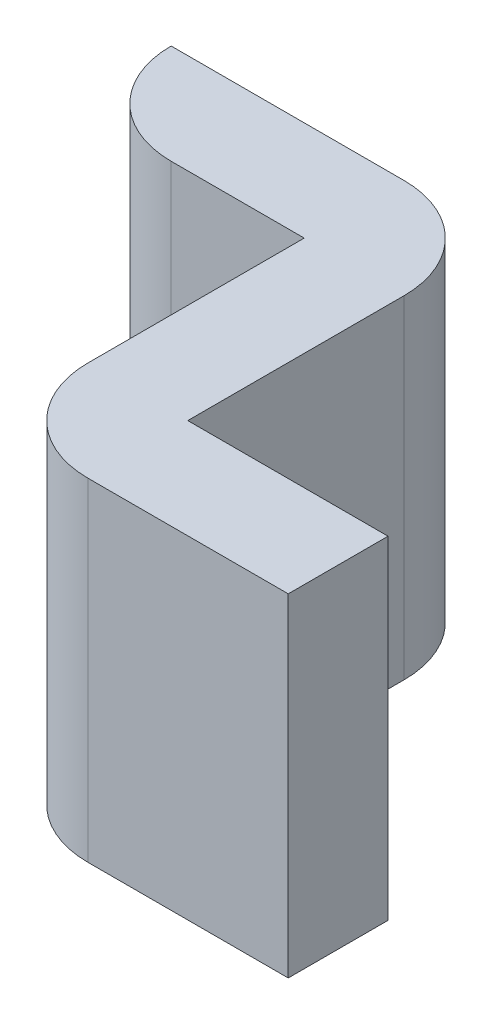
ISO-10303-21;
HEADER;
FILE_DESCRIPTION(('STEP AP214'),'2;1');
FILE_NAME('part.step','',(''),(''),'','','');
FILE_SCHEMA(('AUTOMOTIVE_DESIGN { 1 0 10303 214 1 1 1 1 }'));
ENDSEC;
DATA;
#1=APPLICATION_CONTEXT('core data for automotive mechanical design processes');
#2=APPLICATION_PROTOCOL_DEFINITION('international standard','automotive_design',2000,#1);
#3=PRODUCT_CONTEXT('',#1,'mechanical');
#4=PRODUCT('Part','Part','',(#3));
#5=PRODUCT_RELATED_PRODUCT_CATEGORY('part','',(#4));
#6=PRODUCT_DEFINITION_FORMATION('','',#4);
#7=PRODUCT_DEFINITION_CONTEXT('part definition',#1,'design');
#8=PRODUCT_DEFINITION('design','',#6,#7);
#9=PRODUCT_DEFINITION_SHAPE('','',#8);
#10=(LENGTH_UNIT() NAMED_UNIT(*) SI_UNIT(.MILLI.,.METRE.));
#11=(NAMED_UNIT(*) PLANE_ANGLE_UNIT() SI_UNIT($,.RADIAN.));
#12=(NAMED_UNIT(*) SI_UNIT($,.STERADIAN.) SOLID_ANGLE_UNIT());
#13=UNCERTAINTY_MEASURE_WITH_UNIT(LENGTH_MEASURE(1.E-05),#10,'distance_accuracy_value','');
#14=(GEOMETRIC_REPRESENTATION_CONTEXT(3) GLOBAL_UNCERTAINTY_ASSIGNED_CONTEXT((#13)) GLOBAL_UNIT_ASSIGNED_CONTEXT((#10,
#11,#12)) REPRESENTATION_CONTEXT('',''));
#15=CARTESIAN_POINT('',(0.,0.,0.));
#16=DIRECTION('',(0.,0.,1.));
#17=DIRECTION('',(1.,0.,0.));
#18=AXIS2_PLACEMENT_3D('',#15,#16,#17);
#19=CARTESIAN_POINT('',(1.2619,1.927,0.));
#20=DIRECTION('',(0.,-1.,0.));
#21=DIRECTION('',(0.,0.,-1.));
#22=AXIS2_PLACEMENT_3D('',#19,#20,#21);
#23=PLANE('',#22);
#24=DIRECTION('',(-1.,0.,0.));
#25=VECTOR('',#24,1.);
#26=CARTESIAN_POINT('',(1.3381,1.927,0.0762));
#27=LINE('',#26,#25);
#28=CARTESIAN_POINT('',(1.3381,1.927,0.0762));
#29=VERTEX_POINT('',#28);
#30=CARTESIAN_POINT('',(1.4397,1.927,0.0762));
#31=VERTEX_POINT('',#30);
#32=EDGE_CURVE('E102',#29,#31,#27,.F.);
#33=ORIENTED_EDGE('',*,*,#32,.T.);
#34=DIRECTION('',(0.,0.,-1.));
#35=VECTOR('',#34,1.);
#36=CARTESIAN_POINT('',(1.4397,1.927,0.0762));
#37=LINE('',#36,#35);
#38=CARTESIAN_POINT('',(1.4397,1.927,0.2413));
#39=VERTEX_POINT('',#38);
#40=EDGE_CURVE('E105',#31,#39,#37,.F.);
#41=ORIENTED_EDGE('',*,*,#40,.T.);
#42=CARTESIAN_POINT('',(1.5159,1.927,0.2413));
#43=DIRECTION('',(0.,-1.,0.));
#44=DIRECTION('',(0.,0.,-1.));
#45=AXIS2_PLACEMENT_3D('',#42,#43,#44);
#46=CIRCLE('',#45,0.0762);
#47=CARTESIAN_POINT('',(1.5159,1.927,0.3175));
#48=VERTEX_POINT('',#47);
#49=EDGE_CURVE('E117',#48,#39,#46,.T.);
#50=ORIENTED_EDGE('',*,*,#49,.F.);
#51=DIRECTION('',(-1.,0.,0.));
#52=VECTOR('',#51,1.);
#53=CARTESIAN_POINT('',(1.5159,1.927,0.3175));
#54=LINE('',#53,#52);
#55=CARTESIAN_POINT('',(1.6688,1.927,0.3175));
#56=VERTEX_POINT('',#55);
#57=EDGE_CURVE('E134',#48,#56,#54,.F.);
#58=ORIENTED_EDGE('',*,*,#57,.T.);
#59=DIRECTION('',(0.,0.,1.));
#60=VECTOR('',#59,1.);
#61=CARTESIAN_POINT('',(1.6688,1.927,0.3175));
#62=LINE('',#61,#60);
#63=CARTESIAN_POINT('',(1.6688,1.927,0.2413));
#64=VERTEX_POINT('',#63);
#65=EDGE_CURVE('E90',#56,#64,#62,.F.);
#66=ORIENTED_EDGE('',*,*,#65,.T.);
#67=DIRECTION('',(1.,0.,0.));
#68=VECTOR('',#67,1.);
#69=CARTESIAN_POINT('',(1.6688,1.927,0.2413));
#70=LINE('',#69,#68);
#71=CARTESIAN_POINT('',(1.5159,1.927,0.2413));
#72=VERTEX_POINT('',#71);
#73=EDGE_CURVE('E87',#64,#72,#70,.F.);
#74=ORIENTED_EDGE('',*,*,#73,.T.);
#75=DIRECTION('',(0.,0.,1.));
#76=VECTOR('',#75,1.);
#77=CARTESIAN_POINT('',(1.5159,1.927,0.2413));
#78=LINE('',#77,#76);
#79=CARTESIAN_POINT('',(1.5159,1.927,0.0762));
#80=VERTEX_POINT('',#79);
#81=EDGE_CURVE('E82',#72,#80,#78,.F.);
#82=ORIENTED_EDGE('',*,*,#81,.T.);
#83=CARTESIAN_POINT('',(1.4397,1.927,0.0762));
#84=DIRECTION('',(0.,-1.,0.));
#85=DIRECTION('',(0.,0.,-1.));
#86=AXIS2_PLACEMENT_3D('',#83,#84,#85);
#87=CIRCLE('',#86,0.0762);
#88=CARTESIAN_POINT('',(1.4397,1.927,0.));
#89=VERTEX_POINT('',#88);
#90=EDGE_CURVE('E20',#89,#80,#87,.T.);
#91=ORIENTED_EDGE('',*,*,#90,.F.);
#92=DIRECTION('',(1.,0.,0.));
#93=VECTOR('',#92,1.);
#94=CARTESIAN_POINT('',(1.4397,1.927,0.));
#95=LINE('',#94,#93);
#96=CARTESIAN_POINT('',(1.2619,1.927,0.));
#97=VERTEX_POINT('',#96);
#98=EDGE_CURVE('E76',#89,#97,#95,.F.);
#99=ORIENTED_EDGE('',*,*,#98,.T.);
#100=CARTESIAN_POINT('',(1.3381,1.927,0.));
#101=DIRECTION('',(0.,-1.,0.));
#102=DIRECTION('',(0.,0.,-1.));
#103=AXIS2_PLACEMENT_3D('',#100,#101,#102);
#104=CIRCLE('',#103,0.0762);
#105=EDGE_CURVE('E108',#29,#97,#104,.T.);
#106=ORIENTED_EDGE('',*,*,#105,.F.);
#107=EDGE_LOOP('',(#33,#41,#50,#58,#66,#74,#82,#91,#99,#106));
#108=FACE_BOUND('',#107,.T.);
#109=ADVANCED_FACE('F17',(#108),#23,.F.);
#110=CARTESIAN_POINT('',(1.4397,1.673,0.));
#111=DIRECTION('',(0.,0.,1.));
#112=DIRECTION('',(1.,0.,0.));
#113=AXIS2_PLACEMENT_3D('',#110,#111,#112);
#114=PLANE('',#113);
#115=DIRECTION('',(0.,-1.,0.));
#116=VECTOR('',#115,1.);
#117=CARTESIAN_POINT('',(1.2619,1.673,0.));
#118=LINE('',#117,#116);
#119=CARTESIAN_POINT('',(1.2619,1.673,0.));
#120=VERTEX_POINT('',#119);
#121=EDGE_CURVE('E187',#97,#120,#118,.T.);
#122=ORIENTED_EDGE('',*,*,#121,.F.);
#123=ORIENTED_EDGE('',*,*,#98,.F.);
#124=DIRECTION('',(0.,-1.,0.));
#125=VECTOR('',#124,1.);
#126=CARTESIAN_POINT('',(1.4397,1.673,0.));
#127=LINE('',#126,#125);
#128=CARTESIAN_POINT('',(1.4397,1.673,0.));
#129=VERTEX_POINT('',#128);
#130=EDGE_CURVE('E159',#129,#89,#127,.F.);
#131=ORIENTED_EDGE('',*,*,#130,.F.);
#132=DIRECTION('',(1.,0.,0.));
#133=VECTOR('',#132,1.);
#134=CARTESIAN_POINT('',(1.2619,1.673,0.));
#135=LINE('',#134,#133);
#136=EDGE_CURVE('E186',#120,#129,#135,.T.);
#137=ORIENTED_EDGE('',*,*,#136,.F.);
#138=EDGE_LOOP('',(#122,#123,#131,#137));
#139=FACE_BOUND('',#138,.T.);
#140=ADVANCED_FACE('F217',(#139),#114,.F.);
#141=CARTESIAN_POINT('',(1.4397,1.673,0.0762));
#142=DIRECTION('',(0.,-1.,0.));
#143=DIRECTION('',(0.,0.,-1.));
#144=AXIS2_PLACEMENT_3D('',#141,#142,#143);
#145=CYLINDRICAL_SURFACE('',#144,0.0762);
#146=ORIENTED_EDGE('',*,*,#90,.T.);
#147=DIRECTION('',(0.,1.,0.));
#148=VECTOR('',#147,1.);
#149=CARTESIAN_POINT('',(1.5159,1.673,0.0762));
#150=LINE('',#149,#148);
#151=CARTESIAN_POINT('',(1.5159,1.673,0.0762));
#152=VERTEX_POINT('',#151);
#153=EDGE_CURVE('E157',#80,#152,#150,.F.);
#154=ORIENTED_EDGE('',*,*,#153,.T.);
#155=CARTESIAN_POINT('',(1.4397,1.673,0.0762));
#156=DIRECTION('',(0.,-1.,0.));
#157=DIRECTION('',(0.,0.,-1.));
#158=AXIS2_PLACEMENT_3D('',#155,#156,#157);
#159=CIRCLE('',#158,0.0762);
#160=EDGE_CURVE('E183',#129,#152,#159,.T.);
#161=ORIENTED_EDGE('',*,*,#160,.F.);
#162=ORIENTED_EDGE('',*,*,#130,.T.);
#163=EDGE_LOOP('',(#146,#154,#161,#162));
#164=FACE_BOUND('',#163,.T.);
#165=ADVANCED_FACE('F214',(#164),#145,.T.);
#166=CARTESIAN_POINT('',(1.5159,1.673,0.2413));
#167=DIRECTION('',(-1.,0.,0.));
#168=DIRECTION('',(0.,0.,1.));
#169=AXIS2_PLACEMENT_3D('',#166,#167,#168);
#170=PLANE('',#169);
#171=ORIENTED_EDGE('',*,*,#153,.F.);
#172=ORIENTED_EDGE('',*,*,#81,.F.);
#173=DIRECTION('',(0.,1.,0.));
#174=VECTOR('',#173,1.);
#175=CARTESIAN_POINT('',(1.5159,1.673,0.2413));
#176=LINE('',#175,#174);
#177=CARTESIAN_POINT('',(1.5159,1.673,0.2413));
#178=VERTEX_POINT('',#177);
#179=EDGE_CURVE('E153',#72,#178,#176,.F.);
#180=ORIENTED_EDGE('',*,*,#179,.T.);
#181=DIRECTION('',(0.,0.,-1.));
#182=VECTOR('',#181,1.);
#183=CARTESIAN_POINT('',(1.5159,1.673,0.));
#184=LINE('',#183,#182);
#185=EDGE_CURVE('E150',#152,#178,#184,.F.);
#186=ORIENTED_EDGE('',*,*,#185,.F.);
#187=EDGE_LOOP('',(#171,#172,#180,#186));
#188=FACE_BOUND('',#187,.T.);
#189=ADVANCED_FACE('F211',(#188),#170,.F.);
#190=CARTESIAN_POINT('',(1.6688,1.673,0.2413));
#191=DIRECTION('',(0.,0.,1.));
#192=DIRECTION('',(1.,0.,0.));
#193=AXIS2_PLACEMENT_3D('',#190,#191,#192);
#194=PLANE('',#193);
#195=ORIENTED_EDGE('',*,*,#179,.F.);
#196=ORIENTED_EDGE('',*,*,#73,.F.);
#197=DIRECTION('',(0.,1.,0.));
#198=VECTOR('',#197,1.);
#199=CARTESIAN_POINT('',(1.6688,1.673,0.2413));
#200=LINE('',#199,#198);
#201=CARTESIAN_POINT('',(1.6688,1.673,0.2413));
#202=VERTEX_POINT('',#201);
#203=EDGE_CURVE('E144',#64,#202,#200,.F.);
#204=ORIENTED_EDGE('',*,*,#203,.T.);
#205=DIRECTION('',(1.,0.,0.));
#206=VECTOR('',#205,1.);
#207=CARTESIAN_POINT('',(1.2619,1.673,0.2413));
#208=LINE('',#207,#206);
#209=EDGE_CURVE('E141',#178,#202,#208,.T.);
#210=ORIENTED_EDGE('',*,*,#209,.F.);
#211=EDGE_LOOP('',(#195,#196,#204,#210));
#212=FACE_BOUND('',#211,.T.);
#213=ADVANCED_FACE('F208',(#212),#194,.F.);
#214=CARTESIAN_POINT('',(1.6688,1.673,0.3175));
#215=DIRECTION('',(-1.,0.,0.));
#216=DIRECTION('',(0.,0.,1.));
#217=AXIS2_PLACEMENT_3D('',#214,#215,#216);
#218=PLANE('',#217);
#219=ORIENTED_EDGE('',*,*,#203,.F.);
#220=ORIENTED_EDGE('',*,*,#65,.F.);
#221=DIRECTION('',(0.,1.,0.));
#222=VECTOR('',#221,1.);
#223=CARTESIAN_POINT('',(1.6688,1.673,0.3175));
#224=LINE('',#223,#222);
#225=CARTESIAN_POINT('',(1.6688,1.673,0.3175));
#226=VERTEX_POINT('',#225);
#227=EDGE_CURVE('E132',#56,#226,#224,.F.);
#228=ORIENTED_EDGE('',*,*,#227,.T.);
#229=DIRECTION('',(0.,0.,-1.));
#230=VECTOR('',#229,1.);
#231=CARTESIAN_POINT('',(1.6688,1.673,0.));
#232=LINE('',#231,#230);
#233=EDGE_CURVE('E137',#202,#226,#232,.F.);
#234=ORIENTED_EDGE('',*,*,#233,.F.);
#235=EDGE_LOOP('',(#219,#220,#228,#234));
#236=FACE_BOUND('',#235,.T.);
#237=ADVANCED_FACE('F195',(#236),#218,.F.);
#238=CARTESIAN_POINT('',(1.5159,1.673,0.3175));
#239=DIRECTION('',(0.,0.,-1.));
#240=DIRECTION('',(-1.,0.,0.));
#241=AXIS2_PLACEMENT_3D('',#238,#239,#240);
#242=PLANE('',#241);
#243=ORIENTED_EDGE('',*,*,#227,.F.);
#244=ORIENTED_EDGE('',*,*,#57,.F.);
#245=DIRECTION('',(0.,-1.,0.));
#246=VECTOR('',#245,1.);
#247=CARTESIAN_POINT('',(1.5159,1.673,0.3175));
#248=LINE('',#247,#246);
#249=CARTESIAN_POINT('',(1.5159,1.673,0.3175));
#250=VERTEX_POINT('',#249);
#251=EDGE_CURVE('E129',#250,#48,#248,.F.);
#252=ORIENTED_EDGE('',*,*,#251,.F.);
#253=DIRECTION('',(1.,0.,0.));
#254=VECTOR('',#253,1.);
#255=CARTESIAN_POINT('',(1.2619,1.673,0.3175));
#256=LINE('',#255,#254);
#257=EDGE_CURVE('E140',#226,#250,#256,.F.);
#258=ORIENTED_EDGE('',*,*,#257,.F.);
#259=EDGE_LOOP('',(#243,#244,#252,#258));
#260=FACE_BOUND('',#259,.T.);
#261=ADVANCED_FACE('F198',(#260),#242,.F.);
#262=CARTESIAN_POINT('',(1.5159,1.673,0.2413));
#263=DIRECTION('',(0.,-1.,0.));
#264=DIRECTION('',(0.,0.,-1.));
#265=AXIS2_PLACEMENT_3D('',#262,#263,#264);
#266=CYLINDRICAL_SURFACE('',#265,0.0762);
#267=ORIENTED_EDGE('',*,*,#49,.T.);
#268=DIRECTION('',(0.,1.,0.));
#269=VECTOR('',#268,1.);
#270=CARTESIAN_POINT('',(1.4397,1.673,0.2413));
#271=LINE('',#270,#269);
#272=CARTESIAN_POINT('',(1.4397,1.673,0.2413));
#273=VERTEX_POINT('',#272);
#274=EDGE_CURVE('E111',#39,#273,#271,.F.);
#275=ORIENTED_EDGE('',*,*,#274,.T.);
#276=CARTESIAN_POINT('',(1.5159,1.673,0.2413));
#277=DIRECTION('',(0.,-1.,0.));
#278=DIRECTION('',(0.,0.,-1.));
#279=AXIS2_PLACEMENT_3D('',#276,#277,#278);
#280=CIRCLE('',#279,0.0762);
#281=EDGE_CURVE('E179',#250,#273,#280,.T.);
#282=ORIENTED_EDGE('',*,*,#281,.F.);
#283=ORIENTED_EDGE('',*,*,#251,.T.);
#284=EDGE_LOOP('',(#267,#275,#282,#283));
#285=FACE_BOUND('',#284,.T.);
#286=ADVANCED_FACE('F189',(#285),#266,.T.);
#287=CARTESIAN_POINT('',(1.4397,1.673,0.0762));
#288=DIRECTION('',(1.,0.,0.));
#289=DIRECTION('',(0.,0.,-1.));
#290=AXIS2_PLACEMENT_3D('',#287,#288,#289);
#291=PLANE('',#290);
#292=ORIENTED_EDGE('',*,*,#274,.F.);
#293=ORIENTED_EDGE('',*,*,#40,.F.);
#294=DIRECTION('',(0.,1.,0.));
#295=VECTOR('',#294,1.);
#296=CARTESIAN_POINT('',(1.4397,1.673,0.0762));
#297=LINE('',#296,#295);
#298=CARTESIAN_POINT('',(1.4397,1.673,0.0762));
#299=VERTEX_POINT('',#298);
#300=EDGE_CURVE('E110',#31,#299,#297,.F.);
#301=ORIENTED_EDGE('',*,*,#300,.T.);
#302=DIRECTION('',(0.,0.,-1.));
#303=VECTOR('',#302,1.);
#304=CARTESIAN_POINT('',(1.4397,1.673,0.));
#305=LINE('',#304,#303);
#306=EDGE_CURVE('E182',#273,#299,#305,.T.);
#307=ORIENTED_EDGE('',*,*,#306,.F.);
#308=EDGE_LOOP('',(#292,#293,#301,#307));
#309=FACE_BOUND('',#308,.T.);
#310=ADVANCED_FACE('F115',(#309),#291,.F.);
#311=CARTESIAN_POINT('',(1.3381,1.673,0.0762));
#312=DIRECTION('',(0.,0.,-1.));
#313=DIRECTION('',(-1.,0.,0.));
#314=AXIS2_PLACEMENT_3D('',#311,#312,#313);
#315=PLANE('',#314);
#316=ORIENTED_EDGE('',*,*,#300,.F.);
#317=ORIENTED_EDGE('',*,*,#32,.F.);
#318=DIRECTION('',(0.,-1.,0.));
#319=VECTOR('',#318,1.);
#320=CARTESIAN_POINT('',(1.3381,1.673,0.0762));
#321=LINE('',#320,#319);
#322=CARTESIAN_POINT('',(1.3381,1.673,0.0762));
#323=VERTEX_POINT('',#322);
#324=EDGE_CURVE('E35',#323,#29,#321,.F.);
#325=ORIENTED_EDGE('',*,*,#324,.F.);
#326=DIRECTION('',(1.,0.,0.));
#327=VECTOR('',#326,1.);
#328=CARTESIAN_POINT('',(1.2619,1.673,0.0762));
#329=LINE('',#328,#327);
#330=EDGE_CURVE('E26',#299,#323,#329,.F.);
#331=ORIENTED_EDGE('',*,*,#330,.F.);
#332=EDGE_LOOP('',(#316,#317,#325,#331));
#333=FACE_BOUND('',#332,.T.);
#334=ADVANCED_FACE('F119',(#333),#315,.F.);
#335=CARTESIAN_POINT('',(1.3381,1.673,0.));
#336=DIRECTION('',(0.,-1.,0.));
#337=DIRECTION('',(0.,0.,-1.));
#338=AXIS2_PLACEMENT_3D('',#335,#336,#337);
#339=CYLINDRICAL_SURFACE('',#338,0.0762);
#340=ORIENTED_EDGE('',*,*,#105,.T.);
#341=ORIENTED_EDGE('',*,*,#121,.T.);
#342=CARTESIAN_POINT('',(1.3381,1.673,0.));
#343=DIRECTION('',(0.,-1.,0.));
#344=DIRECTION('',(0.,0.,-1.));
#345=AXIS2_PLACEMENT_3D('',#342,#343,#344);
#346=CIRCLE('',#345,0.0762);
#347=EDGE_CURVE('E11',#323,#120,#346,.T.);
#348=ORIENTED_EDGE('',*,*,#347,.F.);
#349=ORIENTED_EDGE('',*,*,#324,.T.);
#350=EDGE_LOOP('',(#340,#341,#348,#349));
#351=FACE_BOUND('',#350,.T.);
#352=ADVANCED_FACE('F219',(#351),#339,.T.);
#353=CARTESIAN_POINT('',(1.2619,1.673,0.));
#354=DIRECTION('',(0.,-1.,0.));
#355=DIRECTION('',(0.,0.,-1.));
#356=AXIS2_PLACEMENT_3D('',#353,#354,#355);
#357=PLANE('',#356);
#358=ORIENTED_EDGE('',*,*,#330,.T.);
#359=ORIENTED_EDGE('',*,*,#347,.T.);
#360=ORIENTED_EDGE('',*,*,#136,.T.);
#361=ORIENTED_EDGE('',*,*,#160,.T.);
#362=ORIENTED_EDGE('',*,*,#185,.T.);
#363=ORIENTED_EDGE('',*,*,#209,.T.);
#364=ORIENTED_EDGE('',*,*,#233,.T.);
#365=ORIENTED_EDGE('',*,*,#257,.T.);
#366=ORIENTED_EDGE('',*,*,#281,.T.);
#367=ORIENTED_EDGE('',*,*,#306,.T.);
#368=EDGE_LOOP('',(#358,#359,#360,#361,#362,#363,#364,#365,#366,#367));
#369=FACE_BOUND('',#368,.T.);
#370=ADVANCED_FACE('F202',(#369),#357,.T.);
#371=CLOSED_SHELL('',(#109,#140,#165,#189,#213,#237,#261,#286,#310,#334,#352,#370));
#372=MANIFOLD_SOLID_BREP('B1',#371);
#373=ADVANCED_BREP_SHAPE_REPRESENTATION('',(#18,#372),#14);
#374=SHAPE_DEFINITION_REPRESENTATION(#9,#373);
ENDSEC;
END-ISO-10303-21;
